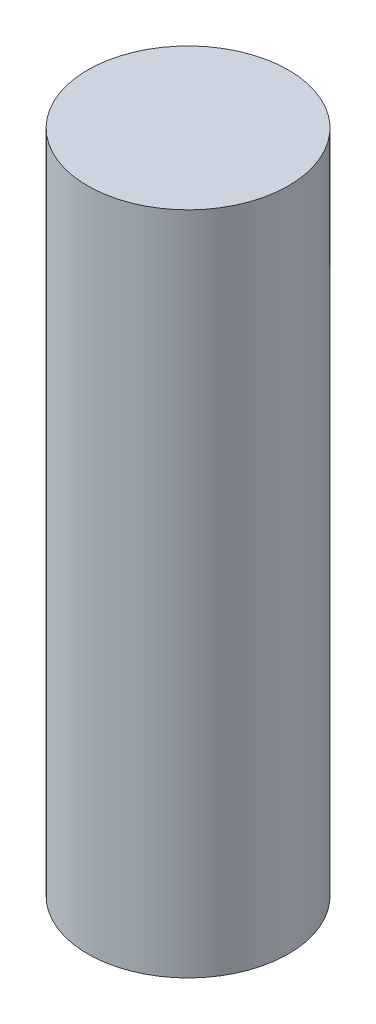
ISO-10303-21;
HEADER;
FILE_DESCRIPTION(('STEP AP214'),'2;1');
FILE_NAME('part.step','',(''),(''),'','','');
FILE_SCHEMA(('AUTOMOTIVE_DESIGN { 1 0 10303 214 1 1 1 1 }'));
ENDSEC;
DATA;
#1=APPLICATION_CONTEXT('core data for automotive mechanical design processes');
#2=APPLICATION_PROTOCOL_DEFINITION('international standard','automotive_design',2000,#1);
#3=PRODUCT_CONTEXT('',#1,'mechanical');
#4=PRODUCT('Part','Part','',(#3));
#5=PRODUCT_RELATED_PRODUCT_CATEGORY('part','',(#4));
#6=PRODUCT_DEFINITION_FORMATION('','',#4);
#7=PRODUCT_DEFINITION_CONTEXT('part definition',#1,'design');
#8=PRODUCT_DEFINITION('design','',#6,#7);
#9=PRODUCT_DEFINITION_SHAPE('','',#8);
#10=(LENGTH_UNIT() NAMED_UNIT(*) SI_UNIT(.MILLI.,.METRE.));
#11=(NAMED_UNIT(*) PLANE_ANGLE_UNIT() SI_UNIT($,.RADIAN.));
#12=(NAMED_UNIT(*) SI_UNIT($,.STERADIAN.) SOLID_ANGLE_UNIT());
#13=UNCERTAINTY_MEASURE_WITH_UNIT(LENGTH_MEASURE(1.E-05),#10,'distance_accuracy_value','');
#14=(GEOMETRIC_REPRESENTATION_CONTEXT(3) GLOBAL_UNCERTAINTY_ASSIGNED_CONTEXT((#13)) GLOBAL_UNIT_ASSIGNED_CONTEXT((#10,
#11,#12)) REPRESENTATION_CONTEXT('',''));
#15=CARTESIAN_POINT('',(0.,0.,0.));
#16=DIRECTION('',(0.,0.,1.));
#17=DIRECTION('',(1.,0.,0.));
#18=AXIS2_PLACEMENT_3D('',#15,#16,#17);
#19=CARTESIAN_POINT('',(0.,152.4,0.));
#20=DIRECTION('',(0.,-1.,0.));
#21=DIRECTION('',(0.,0.,-1.));
#22=AXIS2_PLACEMENT_3D('',#19,#20,#21);
#23=CYLINDRICAL_SURFACE('',#22,22.9999999999997);
#24=CARTESIAN_POINT('',(0.,152.4,0.));
#25=DIRECTION('',(0.,1.,0.));
#26=DIRECTION('',(0.,0.,1.));
#27=AXIS2_PLACEMENT_3D('',#24,#25,#26);
#28=CIRCLE('',#27,22.9999999999997);
#29=CARTESIAN_POINT('',(0.,152.4,-22.9999999999997));
#30=VERTEX_POINT('',#29);
#31=EDGE_CURVE('E10',#30,#30,#28,.T.);
#32=CARTESIAN_POINT('',(0.,0.,0.));
#33=DIRECTION('',(0.,1.,0.));
#34=DIRECTION('',(0.,0.,1.));
#35=AXIS2_PLACEMENT_3D('',#32,#33,#34);
#36=CIRCLE('',#35,22.9999999999997);
#37=CARTESIAN_POINT('',(0.,0.,-22.9999999999997));
#38=VERTEX_POINT('',#37);
#39=EDGE_CURVE('E36',#38,#38,#36,.T.);
#40=CARTESIAN_POINT('',(0.,152.4,-22.9999999999997));
#41=CARTESIAN_POINT('',(0.,150.8125,-22.9999999999997));
#42=CARTESIAN_POINT('',(0.,149.225,-22.9999999999997));
#43=CARTESIAN_POINT('',(0.,146.05,-22.9999999999997));
#44=CARTESIAN_POINT('',(0.,144.4625,-22.9999999999997));
#45=CARTESIAN_POINT('',(0.,141.2875,-22.9999999999997));
#46=CARTESIAN_POINT('',(0.,139.7,-22.9999999999997));
#47=CARTESIAN_POINT('',(0.,136.525,-22.9999999999997));
#48=CARTESIAN_POINT('',(0.,134.9375,-22.9999999999997));
#49=CARTESIAN_POINT('',(0.,131.7625,-22.9999999999997));
#50=CARTESIAN_POINT('',(0.,130.175,-22.9999999999997));
#51=CARTESIAN_POINT('',(0.,127.,-22.9999999999997));
#52=CARTESIAN_POINT('',(0.,125.4125,-22.9999999999997));
#53=CARTESIAN_POINT('',(0.,122.2375,-22.9999999999997));
#54=CARTESIAN_POINT('',(0.,120.65,-22.9999999999997));
#55=CARTESIAN_POINT('',(0.,117.475,-22.9999999999997));
#56=CARTESIAN_POINT('',(0.,115.8875,-22.9999999999997));
#57=CARTESIAN_POINT('',(0.,112.7125,-22.9999999999997));
#58=CARTESIAN_POINT('',(0.,111.125,-22.9999999999997));
#59=CARTESIAN_POINT('',(0.,107.95,-22.9999999999997));
#60=CARTESIAN_POINT('',(0.,106.3625,-22.9999999999997));
#61=CARTESIAN_POINT('',(0.,103.1875,-22.9999999999997));
#62=CARTESIAN_POINT('',(0.,101.6,-22.9999999999997));
#63=CARTESIAN_POINT('',(0.,98.425,-22.9999999999997));
#64=CARTESIAN_POINT('',(0.,96.8375,-22.9999999999997));
#65=CARTESIAN_POINT('',(0.,93.6625,-22.9999999999997));
#66=CARTESIAN_POINT('',(0.,92.075,-22.9999999999997));
#67=CARTESIAN_POINT('',(0.,88.9,-22.9999999999997));
#68=CARTESIAN_POINT('',(0.,87.3125,-22.9999999999997));
#69=CARTESIAN_POINT('',(0.,84.1375,-22.9999999999997));
#70=CARTESIAN_POINT('',(0.,82.55,-22.9999999999997));
#71=CARTESIAN_POINT('',(0.,79.375,-22.9999999999997));
#72=CARTESIAN_POINT('',(0.,77.7875,-22.9999999999997));
#73=CARTESIAN_POINT('',(0.,74.6125,-22.9999999999997));
#74=CARTESIAN_POINT('',(0.,73.025,-22.9999999999997));
#75=CARTESIAN_POINT('',(0.,69.85,-22.9999999999997));
#76=CARTESIAN_POINT('',(0.,68.2625,-22.9999999999997));
#77=CARTESIAN_POINT('',(0.,65.0875,-22.9999999999997));
#78=CARTESIAN_POINT('',(0.,63.5,-22.9999999999997));
#79=CARTESIAN_POINT('',(0.,60.325,-22.9999999999997));
#80=CARTESIAN_POINT('',(0.,58.7375,-22.9999999999997));
#81=CARTESIAN_POINT('',(0.,55.5625,-22.9999999999997));
#82=CARTESIAN_POINT('',(0.,53.975,-22.9999999999997));
#83=CARTESIAN_POINT('',(0.,50.8,-22.9999999999997));
#84=CARTESIAN_POINT('',(0.,49.2125,-22.9999999999997));
#85=CARTESIAN_POINT('',(0.,46.0375,-22.9999999999997));
#86=CARTESIAN_POINT('',(0.,44.45,-22.9999999999997));
#87=CARTESIAN_POINT('',(0.,41.275,-22.9999999999997));
#88=CARTESIAN_POINT('',(0.,39.6875,-22.9999999999997));
#89=CARTESIAN_POINT('',(0.,36.5125,-22.9999999999997));
#90=CARTESIAN_POINT('',(0.,34.925,-22.9999999999997));
#91=CARTESIAN_POINT('',(0.,31.75,-22.9999999999997));
#92=CARTESIAN_POINT('',(0.,30.1625,-22.9999999999997));
#93=CARTESIAN_POINT('',(0.,26.9875,-22.9999999999997));
#94=CARTESIAN_POINT('',(0.,25.4,-22.9999999999997));
#95=CARTESIAN_POINT('',(0.,22.225,-22.9999999999997));
#96=CARTESIAN_POINT('',(0.,20.6375,-22.9999999999997));
#97=CARTESIAN_POINT('',(0.,17.4625,-22.9999999999997));
#98=CARTESIAN_POINT('',(0.,15.875,-22.9999999999997));
#99=CARTESIAN_POINT('',(0.,12.7,-22.9999999999997));
#100=CARTESIAN_POINT('',(0.,11.1125,-22.9999999999997));
#101=CARTESIAN_POINT('',(0.,7.93750000000001,-22.9999999999997));
#102=CARTESIAN_POINT('',(0.,6.35,-22.9999999999997));
#103=CARTESIAN_POINT('',(0.,3.175,-22.9999999999997));
#104=CARTESIAN_POINT('',(0.,1.5875,-22.9999999999997));
#105=CARTESIAN_POINT('',(0.,0.,-22.9999999999997));
#106=B_SPLINE_CURVE_WITH_KNOTS('',3,(#40,#41,#42,#43,#44,#45,#46,#47,#48,#49,#50,#51,#52,#53,
#54,#55,#56,#57,#58,#59,#60,#61,#62,#63,#64,#65,#66,#67,#68,#69,#70,#71,#72,#73,#74,#75,#76,#77,
#78,#79,#80,#81,#82,#83,#84,#85,#86,#87,#88,#89,#90,#91,#92,#93,#94,#95,#96,#97,#98,#99,#100,
#101,#102,#103,#104,#105),.UNSPECIFIED.,.F.,.F.,(4,2,2,2,2,2,2,2,2,2,2,2,2,2,2,2,2,2,2,2,2,2,2,
2,2,2,2,2,2,2,2,2,4),(0.,4.76249999999998,9.52499999999998,14.2875,19.05,23.8125,28.575,33.3375,
38.1,42.8625,47.625,52.3875,57.15,61.9125,66.675,71.4375,76.2,80.9625,85.725,90.4875,95.25,
100.0125,104.775,109.5375,114.3,119.0625,123.825,128.5875,133.35,138.1125,142.875,147.6375,
152.4),.UNSPECIFIED.);
#107=EDGE_CURVE('BSEAM33',#30,#38,#106,.T.);
#108=ORIENTED_EDGE('',*,*,#31,.F.);
#109=ORIENTED_EDGE('',*,*,#39,.T.);
#110=ORIENTED_EDGE('',*,*,#107,.T.);
#111=ORIENTED_EDGE('',*,*,#107,.F.);
#112=EDGE_LOOP('',(#108,#110,#109,#111));
#113=FACE_BOUND('',#112,.T.);
#114=ADVANCED_FACE('F33',(#113),#23,.T.);
#115=CARTESIAN_POINT('',(0.,152.4,0.));
#116=DIRECTION('',(0.,1.,0.));
#117=DIRECTION('',(0.,0.,1.));
#118=AXIS2_PLACEMENT_3D('',#115,#116,#117);
#119=PLANE('',#118);
#120=ORIENTED_EDGE('',*,*,#31,.T.);
#121=EDGE_LOOP('',(#120));
#122=FACE_BOUND('',#121,.T.);
#123=ADVANCED_FACE('F48',(#122),#119,.T.);
#124=CARTESIAN_POINT('',(0.,0.,0.));
#125=DIRECTION('',(0.,1.,0.));
#126=DIRECTION('',(0.,0.,1.));
#127=AXIS2_PLACEMENT_3D('',#124,#125,#126);
#128=PLANE('',#127);
#129=ORIENTED_EDGE('',*,*,#39,.F.);
#130=EDGE_LOOP('',(#129));
#131=FACE_BOUND('',#130,.T.);
#132=ADVANCED_FACE('F46',(#131),#128,.F.);
#133=CLOSED_SHELL('',(#114,#123,#132));
#134=MANIFOLD_SOLID_BREP('B2',#133);
#135=ADVANCED_BREP_SHAPE_REPRESENTATION('',(#18,#134),#14);
#136=SHAPE_DEFINITION_REPRESENTATION(#9,#135);
ENDSEC;
END-ISO-10303-21;
